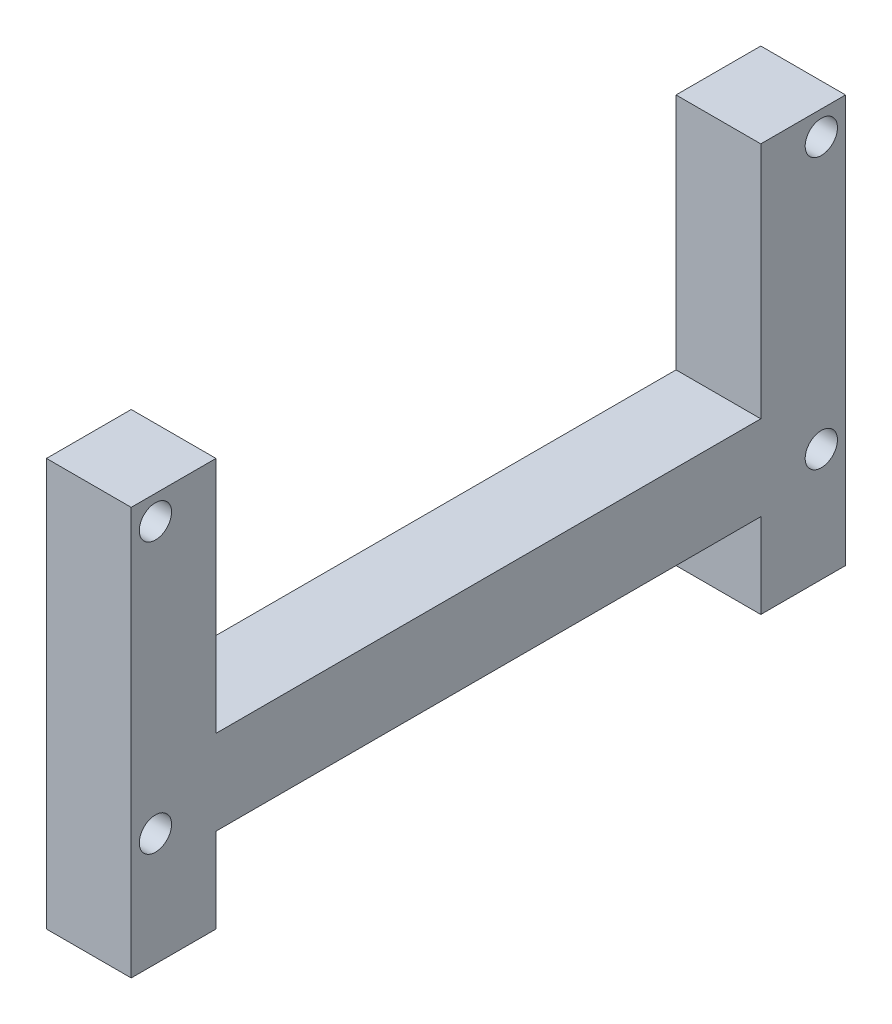
ISO-10303-21;
HEADER;
FILE_DESCRIPTION(('STEP AP214'),'2;1');
FILE_NAME('part.step','',(''),(''),'','','');
FILE_SCHEMA(('AUTOMOTIVE_DESIGN { 1 0 10303 214 1 1 1 1 }'));
ENDSEC;
DATA;
#1=APPLICATION_CONTEXT('core data for automotive mechanical design processes');
#2=APPLICATION_PROTOCOL_DEFINITION('international standard','automotive_design',2000,#1);
#3=PRODUCT_CONTEXT('',#1,'mechanical');
#4=PRODUCT('Part','Part','',(#3));
#5=PRODUCT_RELATED_PRODUCT_CATEGORY('part','',(#4));
#6=PRODUCT_DEFINITION_FORMATION('','',#4);
#7=PRODUCT_DEFINITION_CONTEXT('part definition',#1,'design');
#8=PRODUCT_DEFINITION('design','',#6,#7);
#9=PRODUCT_DEFINITION_SHAPE('','',#8);
#10=(LENGTH_UNIT() NAMED_UNIT(*) SI_UNIT(.MILLI.,.METRE.));
#11=(NAMED_UNIT(*) PLANE_ANGLE_UNIT() SI_UNIT($,.RADIAN.));
#12=(NAMED_UNIT(*) SI_UNIT($,.STERADIAN.) SOLID_ANGLE_UNIT());
#13=UNCERTAINTY_MEASURE_WITH_UNIT(LENGTH_MEASURE(1.E-05),#10,'distance_accuracy_value','');
#14=(GEOMETRIC_REPRESENTATION_CONTEXT(3) GLOBAL_UNCERTAINTY_ASSIGNED_CONTEXT((#13)) GLOBAL_UNIT_ASSIGNED_CONTEXT((#10,
#11,#12)) REPRESENTATION_CONTEXT('',''));
#15=CARTESIAN_POINT('',(0.,0.,0.));
#16=DIRECTION('',(0.,0.,1.));
#17=DIRECTION('',(1.,0.,0.));
#18=AXIS2_PLACEMENT_3D('',#15,#16,#17);
#19=CARTESIAN_POINT('',(5.334,0.,-5.334));
#20=DIRECTION('',(0.,0.,1.));
#21=DIRECTION('',(0.,-1.,0.));
#22=AXIS2_PLACEMENT_3D('',#19,#20,#21);
#23=PLANE('',#22);
#24=DIRECTION('',(0.,1.,0.));
#25=VECTOR('',#24,1.);
#26=CARTESIAN_POINT('',(0.,0.,-5.334));
#27=LINE('',#26,#25);
#28=CARTESIAN_POINT('',(0.,0.,-5.334));
#29=VERTEX_POINT('',#28);
#30=CARTESIAN_POINT('',(0.,5.334,-5.334));
#31=VERTEX_POINT('',#30);
#32=EDGE_CURVE('E167',#29,#31,#27,.T.);
#33=ORIENTED_EDGE('',*,*,#32,.T.);
#34=DIRECTION('',(-1.,0.,0.));
#35=VECTOR('',#34,1.);
#36=CARTESIAN_POINT('',(5.334,5.334,-5.334));
#37=LINE('',#36,#35);
#38=CARTESIAN_POINT('',(5.334,5.334,-5.334));
#39=VERTEX_POINT('',#38);
#40=EDGE_CURVE('E11',#39,#31,#37,.T.);
#41=ORIENTED_EDGE('',*,*,#40,.F.);
#42=DIRECTION('',(0.,1.,0.));
#43=VECTOR('',#42,1.);
#44=CARTESIAN_POINT('',(5.334,0.,-5.334));
#45=LINE('',#44,#43);
#46=CARTESIAN_POINT('',(5.334,0.,-5.334));
#47=VERTEX_POINT('',#46);
#48=EDGE_CURVE('E207',#47,#39,#45,.T.);
#49=ORIENTED_EDGE('',*,*,#48,.F.);
#50=DIRECTION('',(-1.,0.,0.));
#51=VECTOR('',#50,1.);
#52=CARTESIAN_POINT('',(5.334,0.,-5.334));
#53=LINE('',#52,#51);
#54=EDGE_CURVE('E166',#47,#29,#53,.T.);
#55=ORIENTED_EDGE('',*,*,#54,.T.);
#56=EDGE_LOOP('',(#33,#41,#49,#55));
#57=FACE_BOUND('',#56,.T.);
#58=ADVANCED_FACE('F35',(#57),#23,.F.);
#59=CARTESIAN_POINT('',(5.334,5.334,0.));
#60=DIRECTION('',(0.,1.,0.));
#61=DIRECTION('',(0.,0.,1.));
#62=AXIS2_PLACEMENT_3D('',#59,#60,#61);
#63=PLANE('',#62);
#64=DIRECTION('',(0.,0.,-1.));
#65=VECTOR('',#64,1.);
#66=CARTESIAN_POINT('',(0.,5.334,0.));
#67=LINE('',#66,#65);
#68=CARTESIAN_POINT('',(0.,5.334,-39.624));
#69=VERTEX_POINT('',#68);
#70=EDGE_CURVE('E170',#31,#69,#67,.T.);
#71=ORIENTED_EDGE('',*,*,#70,.T.);
#72=DIRECTION('',(-1.,0.,0.));
#73=VECTOR('',#72,1.);
#74=CARTESIAN_POINT('',(5.334,5.334,-39.624));
#75=LINE('',#74,#73);
#76=CARTESIAN_POINT('',(5.334,5.334,-39.624));
#77=VERTEX_POINT('',#76);
#78=EDGE_CURVE('E43',#77,#69,#75,.T.);
#79=ORIENTED_EDGE('',*,*,#78,.F.);
#80=DIRECTION('',(0.,0.,-1.));
#81=VECTOR('',#80,1.);
#82=CARTESIAN_POINT('',(5.334,5.334,0.));
#83=LINE('',#82,#81);
#84=EDGE_CURVE('E102',#39,#77,#83,.T.);
#85=ORIENTED_EDGE('',*,*,#84,.F.);
#86=ORIENTED_EDGE('',*,*,#40,.T.);
#87=EDGE_LOOP('',(#71,#79,#85,#86));
#88=FACE_BOUND('',#87,.T.);
#89=ADVANCED_FACE('F280',(#88),#63,.F.);
#90=CARTESIAN_POINT('',(5.334,0.,-39.624));
#91=DIRECTION('',(0.,0.,-1.));
#92=DIRECTION('',(0.,1.,0.));
#93=AXIS2_PLACEMENT_3D('',#90,#91,#92);
#94=PLANE('',#93);
#95=DIRECTION('',(0.,-1.,0.));
#96=VECTOR('',#95,1.);
#97=CARTESIAN_POINT('',(0.,0.,-39.624));
#98=LINE('',#97,#96);
#99=CARTESIAN_POINT('',(0.,0.,-39.624));
#100=VERTEX_POINT('',#99);
#101=EDGE_CURVE('E172',#69,#100,#98,.T.);
#102=ORIENTED_EDGE('',*,*,#101,.T.);
#103=DIRECTION('',(-1.,0.,0.));
#104=VECTOR('',#103,1.);
#105=CARTESIAN_POINT('',(5.334,0.,-39.624));
#106=LINE('',#105,#104);
#107=CARTESIAN_POINT('',(5.334,0.,-39.624));
#108=VERTEX_POINT('',#107);
#109=EDGE_CURVE('E222',#108,#100,#106,.T.);
#110=ORIENTED_EDGE('',*,*,#109,.F.);
#111=DIRECTION('',(0.,-1.,0.));
#112=VECTOR('',#111,1.);
#113=CARTESIAN_POINT('',(5.334,0.,-39.624));
#114=LINE('',#113,#112);
#115=EDGE_CURVE('E230',#77,#108,#114,.T.);
#116=ORIENTED_EDGE('',*,*,#115,.F.);
#117=ORIENTED_EDGE('',*,*,#78,.T.);
#118=EDGE_LOOP('',(#102,#110,#116,#117));
#119=FACE_BOUND('',#118,.T.);
#120=ADVANCED_FACE('F228',(#119),#94,.F.);
#121=CARTESIAN_POINT('',(5.334,0.,0.));
#122=DIRECTION('',(0.,1.,0.));
#123=DIRECTION('',(0.,0.,1.));
#124=AXIS2_PLACEMENT_3D('',#121,#122,#123);
#125=PLANE('',#124);
#126=DIRECTION('',(0.,0.,-1.));
#127=VECTOR('',#126,1.);
#128=CARTESIAN_POINT('',(0.,0.,0.));
#129=LINE('',#128,#127);
#130=CARTESIAN_POINT('',(0.,0.,-44.958));
#131=VERTEX_POINT('',#130);
#132=EDGE_CURVE('E174',#100,#131,#129,.T.);
#133=ORIENTED_EDGE('',*,*,#132,.T.);
#134=DIRECTION('',(-1.,0.,0.));
#135=VECTOR('',#134,1.);
#136=CARTESIAN_POINT('',(5.334,0.,-44.958));
#137=LINE('',#136,#135);
#138=CARTESIAN_POINT('',(5.334,0.,-44.958));
#139=VERTEX_POINT('',#138);
#140=EDGE_CURVE('E219',#139,#131,#137,.T.);
#141=ORIENTED_EDGE('',*,*,#140,.F.);
#142=DIRECTION('',(0.,0.,-1.));
#143=VECTOR('',#142,1.);
#144=CARTESIAN_POINT('',(5.334,0.,0.));
#145=LINE('',#144,#143);
#146=EDGE_CURVE('E249',#108,#139,#145,.T.);
#147=ORIENTED_EDGE('',*,*,#146,.F.);
#148=ORIENTED_EDGE('',*,*,#109,.T.);
#149=EDGE_LOOP('',(#133,#141,#147,#148));
#150=FACE_BOUND('',#149,.T.);
#151=ADVANCED_FACE('F239',(#150),#125,.F.);
#152=CARTESIAN_POINT('',(5.334,0.,-44.958));
#153=DIRECTION('',(0.,0.,1.));
#154=DIRECTION('',(1.,0.,0.));
#155=AXIS2_PLACEMENT_3D('',#152,#153,#154);
#156=PLANE('',#155);
#157=DIRECTION('',(0.,1.,0.));
#158=VECTOR('',#157,1.);
#159=CARTESIAN_POINT('',(0.,0.,-44.958));
#160=LINE('',#159,#158);
#161=CARTESIAN_POINT('',(0.,25.654,-44.958));
#162=VERTEX_POINT('',#161);
#163=EDGE_CURVE('E176',#131,#162,#160,.T.);
#164=ORIENTED_EDGE('',*,*,#163,.T.);
#165=DIRECTION('',(-1.,0.,0.));
#166=VECTOR('',#165,1.);
#167=CARTESIAN_POINT('',(5.334,25.654,-44.958));
#168=LINE('',#167,#166);
#169=CARTESIAN_POINT('',(5.334,25.654,-44.958));
#170=VERTEX_POINT('',#169);
#171=EDGE_CURVE('E217',#170,#162,#168,.T.);
#172=ORIENTED_EDGE('',*,*,#171,.F.);
#173=DIRECTION('',(0.,1.,0.));
#174=VECTOR('',#173,1.);
#175=CARTESIAN_POINT('',(5.334,0.,-44.958));
#176=LINE('',#175,#174);
#177=EDGE_CURVE('E245',#139,#170,#176,.T.);
#178=ORIENTED_EDGE('',*,*,#177,.F.);
#179=ORIENTED_EDGE('',*,*,#140,.T.);
#180=EDGE_LOOP('',(#164,#172,#178,#179));
#181=FACE_BOUND('',#180,.T.);
#182=ADVANCED_FACE('F243',(#181),#156,.F.);
#183=CARTESIAN_POINT('',(5.334,25.654,0.));
#184=DIRECTION('',(0.,1.,0.));
#185=DIRECTION('',(0.,0.,1.));
#186=AXIS2_PLACEMENT_3D('',#183,#184,#185);
#187=PLANE('',#186);
#188=DIRECTION('',(0.,0.,-1.));
#189=VECTOR('',#188,1.);
#190=CARTESIAN_POINT('',(0.,25.654,0.));
#191=LINE('',#190,#189);
#192=CARTESIAN_POINT('',(0.,25.654,-39.624));
#193=VERTEX_POINT('',#192);
#194=EDGE_CURVE('E179',#193,#162,#191,.T.);
#195=ORIENTED_EDGE('',*,*,#194,.F.);
#196=DIRECTION('',(-1.,0.,0.));
#197=VECTOR('',#196,1.);
#198=CARTESIAN_POINT('',(5.334,25.654,-39.624));
#199=LINE('',#198,#197);
#200=CARTESIAN_POINT('',(5.334,25.654,-39.624));
#201=VERTEX_POINT('',#200);
#202=EDGE_CURVE('E215',#201,#193,#199,.T.);
#203=ORIENTED_EDGE('',*,*,#202,.F.);
#204=DIRECTION('',(0.,0.,-1.));
#205=VECTOR('',#204,1.);
#206=CARTESIAN_POINT('',(5.334,25.654,0.));
#207=LINE('',#206,#205);
#208=EDGE_CURVE('E248',#201,#170,#207,.T.);
#209=ORIENTED_EDGE('',*,*,#208,.T.);
#210=ORIENTED_EDGE('',*,*,#171,.T.);
#211=EDGE_LOOP('',(#195,#203,#209,#210));
#212=FACE_BOUND('',#211,.T.);
#213=ADVANCED_FACE('F419',(#212),#187,.T.);
#214=CARTESIAN_POINT('',(5.334,0.,-39.624));
#215=DIRECTION('',(0.,0.,1.));
#216=DIRECTION('',(1.,0.,0.));
#217=AXIS2_PLACEMENT_3D('',#214,#215,#216);
#218=PLANE('',#217);
#219=DIRECTION('',(0.,1.,0.));
#220=VECTOR('',#219,1.);
#221=CARTESIAN_POINT('',(0.,0.,-39.624));
#222=LINE('',#221,#220);
#223=CARTESIAN_POINT('',(0.,10.668,-39.624));
#224=VERTEX_POINT('',#223);
#225=EDGE_CURVE('E182',#224,#193,#222,.T.);
#226=ORIENTED_EDGE('',*,*,#225,.F.);
#227=DIRECTION('',(-1.,0.,0.));
#228=VECTOR('',#227,1.);
#229=CARTESIAN_POINT('',(5.334,10.668,-39.624));
#230=LINE('',#229,#228);
#231=CARTESIAN_POINT('',(5.334,10.668,-39.624));
#232=VERTEX_POINT('',#231);
#233=EDGE_CURVE('E213',#232,#224,#230,.T.);
#234=ORIENTED_EDGE('',*,*,#233,.F.);
#235=DIRECTION('',(0.,1.,0.));
#236=VECTOR('',#235,1.);
#237=CARTESIAN_POINT('',(5.334,0.,-39.624));
#238=LINE('',#237,#236);
#239=EDGE_CURVE('E251',#232,#201,#238,.T.);
#240=ORIENTED_EDGE('',*,*,#239,.T.);
#241=ORIENTED_EDGE('',*,*,#202,.T.);
#242=EDGE_LOOP('',(#226,#234,#240,#241));
#243=FACE_BOUND('',#242,.T.);
#244=ADVANCED_FACE('F266',(#243),#218,.T.);
#245=CARTESIAN_POINT('',(5.334,10.668,0.));
#246=DIRECTION('',(0.,1.,0.));
#247=DIRECTION('',(0.,0.,1.));
#248=AXIS2_PLACEMENT_3D('',#245,#246,#247);
#249=PLANE('',#248);
#250=DIRECTION('',(0.,0.,-1.));
#251=VECTOR('',#250,1.);
#252=CARTESIAN_POINT('',(0.,10.668,0.));
#253=LINE('',#252,#251);
#254=CARTESIAN_POINT('',(0.,10.668,-5.334));
#255=VERTEX_POINT('',#254);
#256=EDGE_CURVE('E185',#255,#224,#253,.T.);
#257=ORIENTED_EDGE('',*,*,#256,.F.);
#258=DIRECTION('',(-1.,0.,0.));
#259=VECTOR('',#258,1.);
#260=CARTESIAN_POINT('',(5.334,10.668,-5.334));
#261=LINE('',#260,#259);
#262=CARTESIAN_POINT('',(5.334,10.668,-5.334));
#263=VERTEX_POINT('',#262);
#264=EDGE_CURVE('E211',#263,#255,#261,.T.);
#265=ORIENTED_EDGE('',*,*,#264,.F.);
#266=DIRECTION('',(0.,0.,-1.));
#267=VECTOR('',#266,1.);
#268=CARTESIAN_POINT('',(5.334,10.668,0.));
#269=LINE('',#268,#267);
#270=EDGE_CURVE('E258',#263,#232,#269,.T.);
#271=ORIENTED_EDGE('',*,*,#270,.T.);
#272=ORIENTED_EDGE('',*,*,#233,.T.);
#273=EDGE_LOOP('',(#257,#265,#271,#272));
#274=FACE_BOUND('',#273,.T.);
#275=ADVANCED_FACE('F262',(#274),#249,.T.);
#276=CARTESIAN_POINT('',(5.334,0.,-5.334));
#277=DIRECTION('',(0.,0.,1.));
#278=DIRECTION('',(0.,-1.,0.));
#279=AXIS2_PLACEMENT_3D('',#276,#277,#278);
#280=PLANE('',#279);
#281=DIRECTION('',(0.,1.,0.));
#282=VECTOR('',#281,1.);
#283=CARTESIAN_POINT('',(0.,0.,-5.334));
#284=LINE('',#283,#282);
#285=CARTESIAN_POINT('',(0.,25.654,-5.334));
#286=VERTEX_POINT('',#285);
#287=EDGE_CURVE('E188',#255,#286,#284,.T.);
#288=ORIENTED_EDGE('',*,*,#287,.T.);
#289=DIRECTION('',(-1.,0.,0.));
#290=VECTOR('',#289,1.);
#291=CARTESIAN_POINT('',(5.334,25.654,-5.334));
#292=LINE('',#291,#290);
#293=CARTESIAN_POINT('',(5.334,25.654,-5.334));
#294=VERTEX_POINT('',#293);
#295=EDGE_CURVE('E139',#294,#286,#292,.T.);
#296=ORIENTED_EDGE('',*,*,#295,.F.);
#297=DIRECTION('',(0.,1.,0.));
#298=VECTOR('',#297,1.);
#299=CARTESIAN_POINT('',(5.334,0.,-5.334));
#300=LINE('',#299,#298);
#301=EDGE_CURVE('E146',#263,#294,#300,.T.);
#302=ORIENTED_EDGE('',*,*,#301,.F.);
#303=ORIENTED_EDGE('',*,*,#264,.T.);
#304=EDGE_LOOP('',(#288,#296,#302,#303));
#305=FACE_BOUND('',#304,.T.);
#306=ADVANCED_FACE('F270',(#305),#280,.F.);
#307=CARTESIAN_POINT('',(5.334,25.654,0.));
#308=DIRECTION('',(0.,1.,0.));
#309=DIRECTION('',(0.,0.,1.));
#310=AXIS2_PLACEMENT_3D('',#307,#308,#309);
#311=PLANE('',#310);
#312=DIRECTION('',(0.,0.,-1.));
#313=VECTOR('',#312,1.);
#314=CARTESIAN_POINT('',(0.,25.654,0.));
#315=LINE('',#314,#313);
#316=CARTESIAN_POINT('',(0.,25.654,0.));
#317=VERTEX_POINT('',#316);
#318=EDGE_CURVE('E134',#317,#286,#315,.T.);
#319=ORIENTED_EDGE('',*,*,#318,.F.);
#320=DIRECTION('',(-1.,0.,0.));
#321=VECTOR('',#320,1.);
#322=CARTESIAN_POINT('',(5.334,25.654,0.));
#323=LINE('',#322,#321);
#324=CARTESIAN_POINT('',(5.334,25.654,0.));
#325=VERTEX_POINT('',#324);
#326=EDGE_CURVE('E129',#325,#317,#323,.T.);
#327=ORIENTED_EDGE('',*,*,#326,.F.);
#328=DIRECTION('',(0.,0.,-1.));
#329=VECTOR('',#328,1.);
#330=CARTESIAN_POINT('',(5.334,25.654,0.));
#331=LINE('',#330,#329);
#332=EDGE_CURVE('E132',#325,#294,#331,.T.);
#333=ORIENTED_EDGE('',*,*,#332,.T.);
#334=ORIENTED_EDGE('',*,*,#295,.T.);
#335=EDGE_LOOP('',(#319,#327,#333,#334));
#336=FACE_BOUND('',#335,.T.);
#337=ADVANCED_FACE('F131',(#336),#311,.T.);
#338=CARTESIAN_POINT('',(5.334,0.,0.));
#339=DIRECTION('',(0.,0.,1.));
#340=DIRECTION('',(1.,0.,0.));
#341=AXIS2_PLACEMENT_3D('',#338,#339,#340);
#342=PLANE('',#341);
#343=DIRECTION('',(0.,1.,0.));
#344=VECTOR('',#343,1.);
#345=CARTESIAN_POINT('',(0.,0.,0.));
#346=LINE('',#345,#344);
#347=CARTESIAN_POINT('',(0.,0.,0.));
#348=VERTEX_POINT('',#347);
#349=EDGE_CURVE('E192',#348,#317,#346,.T.);
#350=ORIENTED_EDGE('',*,*,#349,.F.);
#351=DIRECTION('',(-1.,0.,0.));
#352=VECTOR('',#351,1.);
#353=CARTESIAN_POINT('',(5.334,0.,0.));
#354=LINE('',#353,#352);
#355=CARTESIAN_POINT('',(5.334,0.,0.));
#356=VERTEX_POINT('',#355);
#357=EDGE_CURVE('E91',#356,#348,#354,.T.);
#358=ORIENTED_EDGE('',*,*,#357,.F.);
#359=DIRECTION('',(0.,1.,0.));
#360=VECTOR('',#359,1.);
#361=CARTESIAN_POINT('',(5.334,0.,0.));
#362=LINE('',#361,#360);
#363=EDGE_CURVE('E143',#356,#325,#362,.T.);
#364=ORIENTED_EDGE('',*,*,#363,.T.);
#365=ORIENTED_EDGE('',*,*,#326,.T.);
#366=EDGE_LOOP('',(#350,#358,#364,#365));
#367=FACE_BOUND('',#366,.T.);
#368=ADVANCED_FACE('F149',(#367),#342,.T.);
#369=CARTESIAN_POINT('',(5.334,7.112,-43.434));
#370=DIRECTION('',(-1.,0.,0.));
#371=DIRECTION('',(0.,0.,1.));
#372=AXIS2_PLACEMENT_3D('',#369,#370,#371);
#373=CYLINDRICAL_SURFACE('',#372,1.016);
#374=CARTESIAN_POINT('',(5.334,7.112,-43.434));
#375=DIRECTION('',(1.,0.,0.));
#376=DIRECTION('',(0.,0.,-1.));
#377=AXIS2_PLACEMENT_3D('',#374,#375,#376);
#378=CIRCLE('',#377,1.016);
#379=CARTESIAN_POINT('',(5.334,7.112,-44.45));
#380=VERTEX_POINT('',#379);
#381=EDGE_CURVE('E160',#380,#380,#378,.F.);
#382=ORIENTED_EDGE('',*,*,#381,.F.);
#383=EDGE_LOOP('',(#382));
#384=FACE_BOUND('',#383,.T.);
#385=CARTESIAN_POINT('',(0.,7.112,-43.434));
#386=DIRECTION('',(1.,0.,0.));
#387=DIRECTION('',(0.,0.,-1.));
#388=AXIS2_PLACEMENT_3D('',#385,#386,#387);
#389=CIRCLE('',#388,1.016);
#390=CARTESIAN_POINT('',(0.,7.112,-44.45));
#391=VERTEX_POINT('',#390);
#392=EDGE_CURVE('E201',#391,#391,#389,.F.);
#393=ORIENTED_EDGE('',*,*,#392,.T.);
#394=EDGE_LOOP('',(#393));
#395=FACE_BOUND('',#394,.T.);
#396=ADVANCED_FACE('F304',(#384,#395),#373,.F.);
#397=CARTESIAN_POINT('',(5.334,24.13,-1.524));
#398=DIRECTION('',(-1.,0.,0.));
#399=DIRECTION('',(0.,0.,1.));
#400=AXIS2_PLACEMENT_3D('',#397,#398,#399);
#401=CYLINDRICAL_SURFACE('',#400,1.016);
#402=CARTESIAN_POINT('',(5.334,24.13,-1.524));
#403=DIRECTION('',(1.,0.,0.));
#404=DIRECTION('',(0.,0.,-1.));
#405=AXIS2_PLACEMENT_3D('',#402,#403,#404);
#406=CIRCLE('',#405,1.016);
#407=CARTESIAN_POINT('',(5.334,24.13,-2.54));
#408=VERTEX_POINT('',#407);
#409=EDGE_CURVE('E157',#408,#408,#406,.T.);
#410=ORIENTED_EDGE('',*,*,#409,.T.);
#411=EDGE_LOOP('',(#410));
#412=FACE_BOUND('',#411,.T.);
#413=CARTESIAN_POINT('',(0.,24.13,-1.524));
#414=DIRECTION('',(1.,0.,0.));
#415=DIRECTION('',(0.,0.,-1.));
#416=AXIS2_PLACEMENT_3D('',#413,#414,#415);
#417=CIRCLE('',#416,1.016);
#418=CARTESIAN_POINT('',(0.,24.13,-2.54));
#419=VERTEX_POINT('',#418);
#420=EDGE_CURVE('E198',#419,#419,#417,.T.);
#421=ORIENTED_EDGE('',*,*,#420,.F.);
#422=EDGE_LOOP('',(#421));
#423=FACE_BOUND('',#422,.T.);
#424=ADVANCED_FACE('F298',(#412,#423),#401,.F.);
#425=CARTESIAN_POINT('',(5.334,7.112,-1.524));
#426=DIRECTION('',(-1.,0.,0.));
#427=DIRECTION('',(0.,0.,1.));
#428=AXIS2_PLACEMENT_3D('',#425,#426,#427);
#429=CYLINDRICAL_SURFACE('',#428,1.016);
#430=CARTESIAN_POINT('',(5.334,7.112,-1.524));
#431=DIRECTION('',(1.,0.,0.));
#432=DIRECTION('',(0.,0.,-1.));
#433=AXIS2_PLACEMENT_3D('',#430,#431,#432);
#434=CIRCLE('',#433,1.016);
#435=CARTESIAN_POINT('',(5.334,7.112,-2.54));
#436=VERTEX_POINT('',#435);
#437=EDGE_CURVE('E151',#436,#436,#434,.T.);
#438=ORIENTED_EDGE('',*,*,#437,.T.);
#439=EDGE_LOOP('',(#438));
#440=FACE_BOUND('',#439,.T.);
#441=CARTESIAN_POINT('',(0.,7.112,-1.524));
#442=DIRECTION('',(1.,0.,0.));
#443=DIRECTION('',(0.,0.,-1.));
#444=AXIS2_PLACEMENT_3D('',#441,#442,#443);
#445=CIRCLE('',#444,1.016);
#446=CARTESIAN_POINT('',(0.,7.112,-2.54));
#447=VERTEX_POINT('',#446);
#448=EDGE_CURVE('E195',#447,#447,#445,.T.);
#449=ORIENTED_EDGE('',*,*,#448,.F.);
#450=EDGE_LOOP('',(#449));
#451=FACE_BOUND('',#450,.T.);
#452=ADVANCED_FACE('F290',(#440,#451),#429,.F.);
#453=CARTESIAN_POINT('',(5.334,0.,0.));
#454=DIRECTION('',(0.,1.,0.));
#455=DIRECTION('',(0.,0.,1.));
#456=AXIS2_PLACEMENT_3D('',#453,#454,#455);
#457=PLANE('',#456);
#458=DIRECTION('',(0.,0.,-1.));
#459=VECTOR('',#458,1.);
#460=CARTESIAN_POINT('',(0.,0.,0.));
#461=LINE('',#460,#459);
#462=EDGE_CURVE('E94',#348,#29,#461,.T.);
#463=ORIENTED_EDGE('',*,*,#462,.T.);
#464=ORIENTED_EDGE('',*,*,#54,.F.);
#465=DIRECTION('',(0.,0.,-1.));
#466=VECTOR('',#465,1.);
#467=CARTESIAN_POINT('',(5.334,0.,0.));
#468=LINE('',#467,#466);
#469=EDGE_CURVE('E51',#356,#47,#468,.T.);
#470=ORIENTED_EDGE('',*,*,#469,.F.);
#471=ORIENTED_EDGE('',*,*,#357,.T.);
#472=EDGE_LOOP('',(#463,#464,#470,#471));
#473=FACE_BOUND('',#472,.T.);
#474=ADVANCED_FACE('F287',(#473),#457,.F.);
#475=CARTESIAN_POINT('',(5.334,24.13,-43.434));
#476=DIRECTION('',(-1.,0.,0.));
#477=DIRECTION('',(0.,0.,1.));
#478=AXIS2_PLACEMENT_3D('',#475,#476,#477);
#479=CYLINDRICAL_SURFACE('',#478,1.016);
#480=CARTESIAN_POINT('',(5.334,24.13,-43.434));
#481=DIRECTION('',(1.,0.,0.));
#482=DIRECTION('',(0.,0.,-1.));
#483=AXIS2_PLACEMENT_3D('',#480,#481,#482);
#484=CIRCLE('',#483,1.016);
#485=CARTESIAN_POINT('',(5.334,24.13,-44.45));
#486=VERTEX_POINT('',#485);
#487=EDGE_CURVE('E163',#486,#486,#484,.F.);
#488=ORIENTED_EDGE('',*,*,#487,.F.);
#489=EDGE_LOOP('',(#488));
#490=FACE_BOUND('',#489,.T.);
#491=CARTESIAN_POINT('',(0.,24.13,-43.434));
#492=DIRECTION('',(1.,0.,0.));
#493=DIRECTION('',(0.,0.,-1.));
#494=AXIS2_PLACEMENT_3D('',#491,#492,#493);
#495=CIRCLE('',#494,1.016);
#496=CARTESIAN_POINT('',(0.,24.13,-44.45));
#497=VERTEX_POINT('',#496);
#498=EDGE_CURVE('E204',#497,#497,#495,.F.);
#499=ORIENTED_EDGE('',*,*,#498,.T.);
#500=EDGE_LOOP('',(#499));
#501=FACE_BOUND('',#500,.T.);
#502=ADVANCED_FACE('F289',(#490,#501),#479,.F.);
#503=CARTESIAN_POINT('',(5.334,0.,0.));
#504=DIRECTION('',(1.,0.,0.));
#505=DIRECTION('',(0.,0.,-1.));
#506=AXIS2_PLACEMENT_3D('',#503,#504,#505);
#507=PLANE('',#506);
#508=ORIENTED_EDGE('',*,*,#48,.T.);
#509=ORIENTED_EDGE('',*,*,#84,.T.);
#510=ORIENTED_EDGE('',*,*,#115,.T.);
#511=ORIENTED_EDGE('',*,*,#146,.T.);
#512=ORIENTED_EDGE('',*,*,#177,.T.);
#513=ORIENTED_EDGE('',*,*,#208,.F.);
#514=ORIENTED_EDGE('',*,*,#239,.F.);
#515=ORIENTED_EDGE('',*,*,#270,.F.);
#516=ORIENTED_EDGE('',*,*,#301,.T.);
#517=ORIENTED_EDGE('',*,*,#332,.F.);
#518=ORIENTED_EDGE('',*,*,#363,.F.);
#519=ORIENTED_EDGE('',*,*,#469,.T.);
#520=EDGE_LOOP('',(#508,#509,#510,#511,#512,#513,#514,#515,#516,#517,#518,#519));
#521=FACE_BOUND('',#520,.T.);
#522=ORIENTED_EDGE('',*,*,#437,.F.);
#523=EDGE_LOOP('',(#522));
#524=FACE_BOUND('',#523,.T.);
#525=ORIENTED_EDGE('',*,*,#409,.F.);
#526=EDGE_LOOP('',(#525));
#527=FACE_BOUND('',#526,.T.);
#528=ORIENTED_EDGE('',*,*,#381,.T.);
#529=EDGE_LOOP('',(#528));
#530=FACE_BOUND('',#529,.T.);
#531=ORIENTED_EDGE('',*,*,#487,.T.);
#532=EDGE_LOOP('',(#531));
#533=FACE_BOUND('',#532,.T.);
#534=ADVANCED_FACE('F141',(#521,#524,#527,#530,#533),#507,.T.);
#535=CARTESIAN_POINT('',(0.,0.,0.));
#536=DIRECTION('',(1.,0.,0.));
#537=DIRECTION('',(0.,0.,-1.));
#538=AXIS2_PLACEMENT_3D('',#535,#536,#537);
#539=PLANE('',#538);
#540=ORIENTED_EDGE('',*,*,#32,.F.);
#541=ORIENTED_EDGE('',*,*,#462,.F.);
#542=ORIENTED_EDGE('',*,*,#349,.T.);
#543=ORIENTED_EDGE('',*,*,#318,.T.);
#544=ORIENTED_EDGE('',*,*,#287,.F.);
#545=ORIENTED_EDGE('',*,*,#256,.T.);
#546=ORIENTED_EDGE('',*,*,#225,.T.);
#547=ORIENTED_EDGE('',*,*,#194,.T.);
#548=ORIENTED_EDGE('',*,*,#163,.F.);
#549=ORIENTED_EDGE('',*,*,#132,.F.);
#550=ORIENTED_EDGE('',*,*,#101,.F.);
#551=ORIENTED_EDGE('',*,*,#70,.F.);
#552=EDGE_LOOP('',(#540,#541,#542,#543,#544,#545,#546,#547,#548,#549,#550,#551));
#553=FACE_BOUND('',#552,.T.);
#554=ORIENTED_EDGE('',*,*,#448,.T.);
#555=EDGE_LOOP('',(#554));
#556=FACE_BOUND('',#555,.T.);
#557=ORIENTED_EDGE('',*,*,#420,.T.);
#558=EDGE_LOOP('',(#557));
#559=FACE_BOUND('',#558,.T.);
#560=ORIENTED_EDGE('',*,*,#392,.F.);
#561=EDGE_LOOP('',(#560));
#562=FACE_BOUND('',#561,.T.);
#563=ORIENTED_EDGE('',*,*,#498,.F.);
#564=EDGE_LOOP('',(#563));
#565=FACE_BOUND('',#564,.T.);
#566=ADVANCED_FACE('F234',(#553,#556,#559,#562,#565),#539,.F.);
#567=CLOSED_SHELL('',(#58,#89,#120,#151,#182,#213,#244,#275,#306,#337,#368,#396,#424,#452,#474,
#502,#534,#566));
#568=MANIFOLD_SOLID_BREP('B2',#567);
#569=ADVANCED_BREP_SHAPE_REPRESENTATION('',(#18,#568),#14);
#570=SHAPE_DEFINITION_REPRESENTATION(#9,#569);
ENDSEC;
END-ISO-10303-21;
